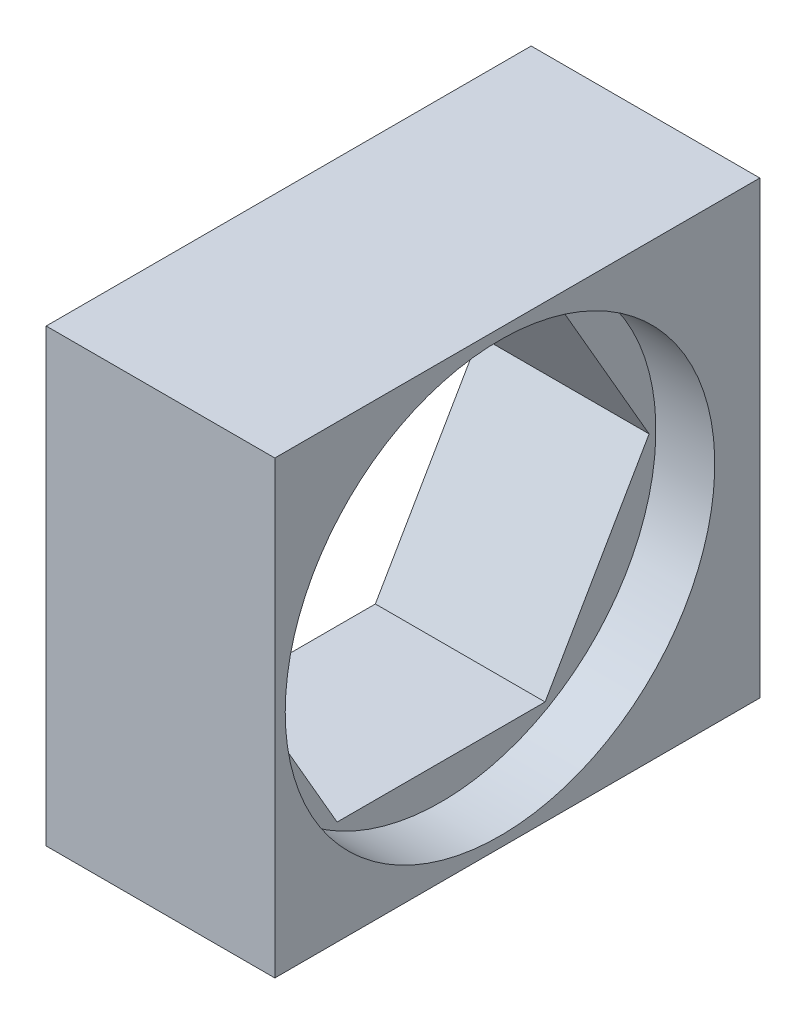
ISO-10303-21;
HEADER;
FILE_DESCRIPTION(('STEP AP214'),'2;1');
FILE_NAME('part.step','',(''),(''),'','','');
FILE_SCHEMA(('AUTOMOTIVE_DESIGN { 1 0 10303 214 1 1 1 1 }'));
ENDSEC;
DATA;
#1=APPLICATION_CONTEXT('core data for automotive mechanical design processes');
#2=APPLICATION_PROTOCOL_DEFINITION('international standard','automotive_design',2000,#1);
#3=PRODUCT_CONTEXT('',#1,'mechanical');
#4=PRODUCT('Part','Part','',(#3));
#5=PRODUCT_RELATED_PRODUCT_CATEGORY('part','',(#4));
#6=PRODUCT_DEFINITION_FORMATION('','',#4);
#7=PRODUCT_DEFINITION_CONTEXT('part definition',#1,'design');
#8=PRODUCT_DEFINITION('design','',#6,#7);
#9=PRODUCT_DEFINITION_SHAPE('','',#8);
#10=(LENGTH_UNIT() NAMED_UNIT(*) SI_UNIT(.MILLI.,.METRE.));
#11=(NAMED_UNIT(*) PLANE_ANGLE_UNIT() SI_UNIT($,.RADIAN.));
#12=(NAMED_UNIT(*) SI_UNIT($,.STERADIAN.) SOLID_ANGLE_UNIT());
#13=UNCERTAINTY_MEASURE_WITH_UNIT(LENGTH_MEASURE(1.E-05),#10,'distance_accuracy_value','');
#14=(GEOMETRIC_REPRESENTATION_CONTEXT(3) GLOBAL_UNCERTAINTY_ASSIGNED_CONTEXT((#13)) GLOBAL_UNIT_ASSIGNED_CONTEXT((#10,
#11,#12)) REPRESENTATION_CONTEXT('',''));
#15=CARTESIAN_POINT('',(0.,0.,0.));
#16=DIRECTION('',(0.,0.,1.));
#17=DIRECTION('',(1.,0.,0.));
#18=AXIS2_PLACEMENT_3D('',#15,#16,#17);
#19=CARTESIAN_POINT('',(46.308348754,-23.8,-22.5022213997861));
#20=DIRECTION('',(0.,-1.,0.));
#21=DIRECTION('',(0.,0.,-1.));
#22=AXIS2_PLACEMENT_3D('',#19,#20,#21);
#23=PLANE('',#22);
#24=DIRECTION('',(-1.,0.,0.));
#25=VECTOR('',#24,1.);
#26=CARTESIAN_POINT('',(46.308348754,-23.8,-22.5022213997861));
#27=LINE('',#26,#25);
#28=CARTESIAN_POINT('',(46.008348754,-23.8,-22.5022213997861));
#29=VERTEX_POINT('',#28);
#30=CARTESIAN_POINT('',(41.108348754,-23.8,-22.5022213997861));
#31=VERTEX_POINT('',#30);
#32=EDGE_CURVE('E61',#29,#31,#27,.T.);
#33=ORIENTED_EDGE('',*,*,#32,.F.);
#34=DIRECTION('',(0.,0.,1.));
#35=VECTOR('',#34,1.);
#36=CARTESIAN_POINT('',(46.008348754,-23.8,-22.5022213997861));
#37=LINE('',#36,#35);
#38=CARTESIAN_POINT('',(46.008348754,-23.8,-16.4977786002139));
#39=VERTEX_POINT('',#38);
#40=EDGE_CURVE('E60',#29,#39,#37,.T.);
#41=ORIENTED_EDGE('',*,*,#40,.T.);
#42=DIRECTION('',(-1.,0.,0.));
#43=VECTOR('',#42,1.);
#44=CARTESIAN_POINT('',(46.308348754,-23.8,-16.4977786002139));
#45=LINE('',#44,#43);
#46=CARTESIAN_POINT('',(41.108348754,-23.8,-16.4977786002139));
#47=VERTEX_POINT('',#46);
#48=EDGE_CURVE('E145',#39,#47,#45,.T.);
#49=ORIENTED_EDGE('',*,*,#48,.T.);
#50=DIRECTION('',(0.,0.,-1.));
#51=VECTOR('',#50,1.);
#52=CARTESIAN_POINT('',(41.108348754,-23.8,-13.));
#53=LINE('',#52,#51);
#54=EDGE_CURVE('E49',#47,#31,#53,.T.);
#55=ORIENTED_EDGE('',*,*,#54,.T.);
#56=EDGE_LOOP('',(#33,#41,#49,#55));
#57=FACE_BOUND('',#56,.T.);
#58=ADVANCED_FACE('F41',(#57),#23,.T.);
#59=CARTESIAN_POINT('',(46.308348754,-23.8,-16.4977786002139));
#60=DIRECTION('',(0.,-0.5,-0.866025403784438));
#61=DIRECTION('',(0.,0.866025403784438,-0.5));
#62=AXIS2_PLACEMENT_3D('',#59,#60,#61);
#63=PLANE('',#62);
#64=ORIENTED_EDGE('',*,*,#48,.F.);
#65=DIRECTION('',(0.,-0.866025403784438,0.5));
#66=VECTOR('',#65,1.);
#67=CARTESIAN_POINT('',(46.008348754,-23.8,-16.4977786002139));
#68=LINE('',#67,#66);
#69=CARTESIAN_POINT('',(46.008348754,-29.,-13.4955572004279));
#70=VERTEX_POINT('',#69);
#71=EDGE_CURVE('E203',#39,#70,#68,.T.);
#72=ORIENTED_EDGE('',*,*,#71,.T.);
#73=DIRECTION('',(-1.,0.,0.));
#74=VECTOR('',#73,1.);
#75=CARTESIAN_POINT('',(46.308348754,-29.,-13.4955572004279));
#76=LINE('',#75,#74);
#77=CARTESIAN_POINT('',(41.108348754,-29.,-13.4955572004279));
#78=VERTEX_POINT('',#77);
#79=EDGE_CURVE('E142',#70,#78,#76,.T.);
#80=ORIENTED_EDGE('',*,*,#79,.T.);
#81=DIRECTION('',(0.,0.866025403784439,-0.5));
#82=VECTOR('',#81,1.);
#83=CARTESIAN_POINT('',(41.108348754,-24.3395825622994,-16.1862504626203));
#84=LINE('',#83,#82);
#85=EDGE_CURVE('E183',#78,#47,#84,.T.);
#86=ORIENTED_EDGE('',*,*,#85,.T.);
#87=EDGE_LOOP('',(#64,#72,#80,#86));
#88=FACE_BOUND('',#87,.T.);
#89=ADVANCED_FACE('F238',(#88),#63,.T.);
#90=CARTESIAN_POINT('',(46.308348754,-29.,-13.4955572004279));
#91=DIRECTION('',(0.,0.5,-0.866025403784439));
#92=DIRECTION('',(0.,0.866025403784439,0.5));
#93=AXIS2_PLACEMENT_3D('',#90,#91,#92);
#94=PLANE('',#93);
#95=ORIENTED_EDGE('',*,*,#79,.F.);
#96=DIRECTION('',(0.,-0.866025403784439,-0.5));
#97=VECTOR('',#96,1.);
#98=CARTESIAN_POINT('',(46.008348754,-29.,-13.4955572004279));
#99=LINE('',#98,#97);
#100=CARTESIAN_POINT('',(46.008348754,-34.2,-16.4977786002139));
#101=VERTEX_POINT('',#100);
#102=EDGE_CURVE('E200',#70,#101,#99,.T.);
#103=ORIENTED_EDGE('',*,*,#102,.T.);
#104=DIRECTION('',(-1.,0.,0.));
#105=VECTOR('',#104,1.);
#106=CARTESIAN_POINT('',(46.308348754,-34.2,-16.4977786002139));
#107=LINE('',#106,#105);
#108=CARTESIAN_POINT('',(41.108348754,-34.2,-16.4977786002139));
#109=VERTEX_POINT('',#108);
#110=EDGE_CURVE('E136',#101,#109,#107,.T.);
#111=ORIENTED_EDGE('',*,*,#110,.T.);
#112=DIRECTION('',(0.,0.866025403784439,0.5));
#113=VECTOR('',#112,1.);
#114=CARTESIAN_POINT('',(41.108348754,-23.9104174377006,-10.5570853380215));
#115=LINE('',#114,#113);
#116=EDGE_CURVE('E185',#109,#78,#115,.T.);
#117=ORIENTED_EDGE('',*,*,#116,.T.);
#118=EDGE_LOOP('',(#95,#103,#111,#117));
#119=FACE_BOUND('',#118,.T.);
#120=ADVANCED_FACE('F244',(#119),#94,.T.);
#121=CARTESIAN_POINT('',(46.308348754,-34.2,-16.4977786002139));
#122=DIRECTION('',(0.,1.,0.));
#123=DIRECTION('',(0.,0.,1.));
#124=AXIS2_PLACEMENT_3D('',#121,#122,#123);
#125=PLANE('',#124);
#126=ORIENTED_EDGE('',*,*,#110,.F.);
#127=DIRECTION('',(0.,0.,-1.));
#128=VECTOR('',#127,1.);
#129=CARTESIAN_POINT('',(46.008348754,-34.2,-16.4977786002139));
#130=LINE('',#129,#128);
#131=CARTESIAN_POINT('',(46.008348754,-34.2,-22.5022213997861));
#132=VERTEX_POINT('',#131);
#133=EDGE_CURVE('E126',#101,#132,#130,.T.);
#134=ORIENTED_EDGE('',*,*,#133,.T.);
#135=DIRECTION('',(-1.,0.,0.));
#136=VECTOR('',#135,1.);
#137=CARTESIAN_POINT('',(46.308348754,-34.2,-22.5022213997861));
#138=LINE('',#137,#136);
#139=CARTESIAN_POINT('',(41.108348754,-34.2,-22.5022213997861));
#140=VERTEX_POINT('',#139);
#141=EDGE_CURVE('E130',#132,#140,#138,.T.);
#142=ORIENTED_EDGE('',*,*,#141,.T.);
#143=DIRECTION('',(0.,0.,1.));
#144=VECTOR('',#143,1.);
#145=CARTESIAN_POINT('',(41.108348754,-34.2,-13.));
#146=LINE('',#145,#144);
#147=EDGE_CURVE('E178',#140,#109,#146,.T.);
#148=ORIENTED_EDGE('',*,*,#147,.T.);
#149=EDGE_LOOP('',(#126,#134,#142,#148));
#150=FACE_BOUND('',#149,.T.);
#151=ADVANCED_FACE('F197',(#150),#125,.T.);
#152=CARTESIAN_POINT('',(46.308348754,-34.2,-22.5022213997861));
#153=DIRECTION('',(0.,0.5,0.866025403784438));
#154=DIRECTION('',(0.,-0.866025403784438,0.500000000000001));
#155=AXIS2_PLACEMENT_3D('',#152,#153,#154);
#156=PLANE('',#155);
#157=ORIENTED_EDGE('',*,*,#141,.F.);
#158=DIRECTION('',(0.,0.866025403784438,-0.500000000000001));
#159=VECTOR('',#158,1.);
#160=CARTESIAN_POINT('',(46.008348754,-34.2,-22.5022213997861));
#161=LINE('',#160,#159);
#162=CARTESIAN_POINT('',(46.008348754,-29.,-25.5044427995721));
#163=VERTEX_POINT('',#162);
#164=EDGE_CURVE('E117',#132,#163,#161,.T.);
#165=ORIENTED_EDGE('',*,*,#164,.T.);
#166=DIRECTION('',(-1.,0.,0.));
#167=VECTOR('',#166,1.);
#168=CARTESIAN_POINT('',(46.308348754,-29.,-25.5044427995721));
#169=LINE('',#168,#167);
#170=CARTESIAN_POINT('',(41.108348754,-29.,-25.5044427995721));
#171=VERTEX_POINT('',#170);
#172=EDGE_CURVE('E127',#163,#171,#169,.T.);
#173=ORIENTED_EDGE('',*,*,#172,.T.);
#174=DIRECTION('',(0.,-0.866025403784438,0.500000000000001));
#175=VECTOR('',#174,1.);
#176=CARTESIAN_POINT('',(41.108348754,-29.5395825622994,-25.1929146619785));
#177=LINE('',#176,#175);
#178=EDGE_CURVE('E180',#171,#140,#177,.T.);
#179=ORIENTED_EDGE('',*,*,#178,.T.);
#180=EDGE_LOOP('',(#157,#165,#173,#179));
#181=FACE_BOUND('',#180,.T.);
#182=ADVANCED_FACE('F123',(#181),#156,.T.);
#183=CARTESIAN_POINT('',(46.308348754,-29.,-25.5044427995721));
#184=DIRECTION('',(0.,-0.5,0.866025403784438));
#185=DIRECTION('',(0.,-0.866025403784439,-0.5));
#186=AXIS2_PLACEMENT_3D('',#183,#184,#185);
#187=PLANE('',#186);
#188=ORIENTED_EDGE('',*,*,#172,.F.);
#189=DIRECTION('',(0.,0.866025403784439,0.5));
#190=VECTOR('',#189,1.);
#191=CARTESIAN_POINT('',(46.008348754,-29.,-25.5044427995721));
#192=LINE('',#191,#190);
#193=EDGE_CURVE('E11',#163,#29,#192,.T.);
#194=ORIENTED_EDGE('',*,*,#193,.T.);
#195=ORIENTED_EDGE('',*,*,#32,.T.);
#196=DIRECTION('',(0.,-0.866025403784439,-0.5));
#197=VECTOR('',#196,1.);
#198=CARTESIAN_POINT('',(41.108348754,-18.7104174377006,-19.5637495373797));
#199=LINE('',#198,#197);
#200=EDGE_CURVE('E131',#31,#171,#199,.T.);
#201=ORIENTED_EDGE('',*,*,#200,.T.);
#202=EDGE_LOOP('',(#188,#194,#195,#201));
#203=FACE_BOUND('',#202,.T.);
#204=ADVANCED_FACE('F133',(#203),#187,.T.);
#205=CARTESIAN_POINT('',(41.108348754,-22.5,-13.));
#206=DIRECTION('',(1.,0.,0.));
#207=DIRECTION('',(0.,0.,-1.));
#208=AXIS2_PLACEMENT_3D('',#205,#206,#207);
#209=PLANE('',#208);
#210=DIRECTION('',(0.,-1.,0.));
#211=VECTOR('',#210,1.);
#212=CARTESIAN_POINT('',(41.108348754,-22.5,-27.));
#213=LINE('',#212,#211);
#214=CARTESIAN_POINT('',(41.108348754,-22.5,-27.));
#215=VERTEX_POINT('',#214);
#216=CARTESIAN_POINT('',(41.108348754,-35.5,-27.));
#217=VERTEX_POINT('',#216);
#218=EDGE_CURVE('E148',#215,#217,#213,.T.);
#219=ORIENTED_EDGE('',*,*,#218,.T.);
#220=DIRECTION('',(0.,0.,-1.));
#221=VECTOR('',#220,1.);
#222=CARTESIAN_POINT('',(41.108348754,-35.5,-13.));
#223=LINE('',#222,#221);
#224=CARTESIAN_POINT('',(41.108348754,-35.5,-13.));
#225=VERTEX_POINT('',#224);
#226=EDGE_CURVE('E171',#225,#217,#223,.T.);
#227=ORIENTED_EDGE('',*,*,#226,.F.);
#228=DIRECTION('',(0.,-1.,0.));
#229=VECTOR('',#228,1.);
#230=CARTESIAN_POINT('',(41.108348754,-22.5,-13.));
#231=LINE('',#230,#229);
#232=CARTESIAN_POINT('',(41.108348754,-22.5,-13.));
#233=VERTEX_POINT('',#232);
#234=EDGE_CURVE('E150',#233,#225,#231,.T.);
#235=ORIENTED_EDGE('',*,*,#234,.F.);
#236=DIRECTION('',(0.,0.,-1.));
#237=VECTOR('',#236,1.);
#238=CARTESIAN_POINT('',(41.108348754,-22.5,-13.));
#239=LINE('',#238,#237);
#240=EDGE_CURVE('E160',#233,#215,#239,.T.);
#241=ORIENTED_EDGE('',*,*,#240,.T.);
#242=EDGE_LOOP('',(#219,#227,#235,#241));
#243=FACE_BOUND('',#242,.T.);
#244=ORIENTED_EDGE('',*,*,#54,.F.);
#245=ORIENTED_EDGE('',*,*,#85,.F.);
#246=ORIENTED_EDGE('',*,*,#116,.F.);
#247=ORIENTED_EDGE('',*,*,#147,.F.);
#248=ORIENTED_EDGE('',*,*,#178,.F.);
#249=ORIENTED_EDGE('',*,*,#200,.F.);
#250=EDGE_LOOP('',(#244,#245,#246,#247,#248,#249));
#251=FACE_BOUND('',#250,.T.);
#252=ADVANCED_FACE('F43',(#243,#251),#209,.F.);
#253=CARTESIAN_POINT('',(41.108348754,-35.5,-13.));
#254=DIRECTION('',(0.,1.,0.));
#255=DIRECTION('',(0.,0.,1.));
#256=AXIS2_PLACEMENT_3D('',#253,#254,#255);
#257=PLANE('',#256);
#258=DIRECTION('',(1.,0.,0.));
#259=VECTOR('',#258,1.);
#260=CARTESIAN_POINT('',(41.108348754,-35.5,-27.));
#261=LINE('',#260,#259);
#262=CARTESIAN_POINT('',(47.708348754,-35.5,-27.));
#263=VERTEX_POINT('',#262);
#264=EDGE_CURVE('E159',#217,#263,#261,.T.);
#265=ORIENTED_EDGE('',*,*,#264,.T.);
#266=DIRECTION('',(0.,0.,-1.));
#267=VECTOR('',#266,1.);
#268=CARTESIAN_POINT('',(47.708348754,-35.5,-13.));
#269=LINE('',#268,#267);
#270=CARTESIAN_POINT('',(47.708348754,-35.5,-13.));
#271=VERTEX_POINT('',#270);
#272=EDGE_CURVE('E168',#271,#263,#269,.T.);
#273=ORIENTED_EDGE('',*,*,#272,.F.);
#274=DIRECTION('',(1.,0.,0.));
#275=VECTOR('',#274,1.);
#276=CARTESIAN_POINT('',(41.108348754,-35.5,-13.));
#277=LINE('',#276,#275);
#278=EDGE_CURVE('E147',#225,#271,#277,.T.);
#279=ORIENTED_EDGE('',*,*,#278,.F.);
#280=ORIENTED_EDGE('',*,*,#226,.T.);
#281=EDGE_LOOP('',(#265,#273,#279,#280));
#282=FACE_BOUND('',#281,.T.);
#283=ADVANCED_FACE('F214',(#282),#257,.F.);
#284=CARTESIAN_POINT('',(47.708348754,-35.5,-13.));
#285=DIRECTION('',(-1.,0.,0.));
#286=DIRECTION('',(0.,0.,1.));
#287=AXIS2_PLACEMENT_3D('',#284,#285,#286);
#288=PLANE('',#287);
#289=CARTESIAN_POINT('',(47.708348754,-29.,-19.5));
#290=DIRECTION('',(-1.,0.,0.));
#291=DIRECTION('',(0.,0.,1.));
#292=AXIS2_PLACEMENT_3D('',#289,#290,#291);
#293=CIRCLE('',#292,6.2);
#294=CARTESIAN_POINT('',(47.708348754,-29.,-13.3));
#295=VERTEX_POINT('',#294);
#296=EDGE_CURVE('E44',#295,#295,#293,.F.);
#297=ORIENTED_EDGE('',*,*,#296,.F.);
#298=EDGE_LOOP('',(#297));
#299=FACE_BOUND('',#298,.T.);
#300=DIRECTION('',(0.,1.,0.));
#301=VECTOR('',#300,1.);
#302=CARTESIAN_POINT('',(47.708348754,-35.5,-27.));
#303=LINE('',#302,#301);
#304=CARTESIAN_POINT('',(47.708348754,-22.5,-27.));
#305=VERTEX_POINT('',#304);
#306=EDGE_CURVE('E165',#263,#305,#303,.T.);
#307=ORIENTED_EDGE('',*,*,#306,.T.);
#308=DIRECTION('',(0.,0.,-1.));
#309=VECTOR('',#308,1.);
#310=CARTESIAN_POINT('',(47.708348754,-22.5,-13.));
#311=LINE('',#310,#309);
#312=CARTESIAN_POINT('',(47.708348754,-22.5,-13.));
#313=VERTEX_POINT('',#312);
#314=EDGE_CURVE('E170',#313,#305,#311,.T.);
#315=ORIENTED_EDGE('',*,*,#314,.F.);
#316=DIRECTION('',(0.,1.,0.));
#317=VECTOR('',#316,1.);
#318=CARTESIAN_POINT('',(47.708348754,-35.5,-13.));
#319=LINE('',#318,#317);
#320=EDGE_CURVE('E153',#271,#313,#319,.T.);
#321=ORIENTED_EDGE('',*,*,#320,.F.);
#322=ORIENTED_EDGE('',*,*,#272,.T.);
#323=EDGE_LOOP('',(#307,#315,#321,#322));
#324=FACE_BOUND('',#323,.T.);
#325=ADVANCED_FACE('F211',(#299,#324),#288,.F.);
#326=CARTESIAN_POINT('',(47.708348754,-22.5,-13.));
#327=DIRECTION('',(0.,-1.,0.));
#328=DIRECTION('',(0.,0.,-1.));
#329=AXIS2_PLACEMENT_3D('',#326,#327,#328);
#330=PLANE('',#329);
#331=DIRECTION('',(-1.,0.,0.));
#332=VECTOR('',#331,1.);
#333=CARTESIAN_POINT('',(47.708348754,-22.5,-27.));
#334=LINE('',#333,#332);
#335=EDGE_CURVE('E151',#305,#215,#334,.T.);
#336=ORIENTED_EDGE('',*,*,#335,.T.);
#337=ORIENTED_EDGE('',*,*,#240,.F.);
#338=DIRECTION('',(-1.,0.,0.));
#339=VECTOR('',#338,1.);
#340=CARTESIAN_POINT('',(47.708348754,-22.5,-13.));
#341=LINE('',#340,#339);
#342=EDGE_CURVE('E154',#313,#233,#341,.T.);
#343=ORIENTED_EDGE('',*,*,#342,.F.);
#344=ORIENTED_EDGE('',*,*,#314,.T.);
#345=EDGE_LOOP('',(#336,#337,#343,#344));
#346=FACE_BOUND('',#345,.T.);
#347=ADVANCED_FACE('F212',(#346),#330,.F.);
#348=CARTESIAN_POINT('',(0.,0.,-13.));
#349=DIRECTION('',(0.,0.,1.));
#350=DIRECTION('',(1.,0.,0.));
#351=AXIS2_PLACEMENT_3D('',#348,#349,#350);
#352=PLANE('',#351);
#353=ORIENTED_EDGE('',*,*,#234,.T.);
#354=ORIENTED_EDGE('',*,*,#278,.T.);
#355=ORIENTED_EDGE('',*,*,#320,.T.);
#356=ORIENTED_EDGE('',*,*,#342,.T.);
#357=EDGE_LOOP('',(#353,#354,#355,#356));
#358=FACE_BOUND('',#357,.T.);
#359=ADVANCED_FACE('F235',(#358),#352,.T.);
#360=CARTESIAN_POINT('',(0.,0.,-27.));
#361=DIRECTION('',(0.,0.,1.));
#362=DIRECTION('',(1.,0.,0.));
#363=AXIS2_PLACEMENT_3D('',#360,#361,#362);
#364=PLANE('',#363);
#365=ORIENTED_EDGE('',*,*,#218,.F.);
#366=ORIENTED_EDGE('',*,*,#335,.F.);
#367=ORIENTED_EDGE('',*,*,#306,.F.);
#368=ORIENTED_EDGE('',*,*,#264,.F.);
#369=EDGE_LOOP('',(#365,#366,#367,#368));
#370=FACE_BOUND('',#369,.T.);
#371=ADVANCED_FACE('F230',(#370),#364,.F.);
#372=CARTESIAN_POINT('',(47.908348754,-29.,-19.5));
#373=DIRECTION('',(-1.,0.,0.));
#374=DIRECTION('',(0.,0.,1.));
#375=AXIS2_PLACEMENT_3D('',#372,#373,#374);
#376=CYLINDRICAL_SURFACE('',#375,6.2);
#377=CARTESIAN_POINT('',(46.008348754,-29.,-19.5));
#378=DIRECTION('',(1.,0.,0.));
#379=DIRECTION('',(0.,0.,-1.));
#380=AXIS2_PLACEMENT_3D('',#377,#378,#379);
#381=CIRCLE('',#380,6.2);
#382=CARTESIAN_POINT('',(46.008348754,-29.,-13.3));
#383=VERTEX_POINT('',#382);
#384=EDGE_CURVE('E129',#383,#383,#381,.T.);
#385=CARTESIAN_POINT('',(46.008348754,-29.,-13.3));
#386=CARTESIAN_POINT('',(46.0260570873333,-29.,-13.3));
#387=CARTESIAN_POINT('',(46.0437654206667,-29.,-13.3));
#388=CARTESIAN_POINT('',(46.0791820873333,-29.,-13.3));
#389=CARTESIAN_POINT('',(46.0968904206667,-29.,-13.3));
#390=CARTESIAN_POINT('',(46.1323070873333,-29.,-13.3));
#391=CARTESIAN_POINT('',(46.1500154206667,-29.,-13.3));
#392=CARTESIAN_POINT('',(46.1854320873333,-29.,-13.3));
#393=CARTESIAN_POINT('',(46.2031404206667,-29.,-13.3));
#394=CARTESIAN_POINT('',(46.2385570873333,-29.,-13.3));
#395=CARTESIAN_POINT('',(46.2562654206667,-29.,-13.3));
#396=CARTESIAN_POINT('',(46.2916820873333,-29.,-13.3));
#397=CARTESIAN_POINT('',(46.3093904206667,-29.,-13.3));
#398=CARTESIAN_POINT('',(46.3448070873333,-29.,-13.3));
#399=CARTESIAN_POINT('',(46.3625154206667,-29.,-13.3));
#400=CARTESIAN_POINT('',(46.3979320873333,-29.,-13.3));
#401=CARTESIAN_POINT('',(46.4156404206667,-29.,-13.3));
#402=CARTESIAN_POINT('',(46.4510570873333,-29.,-13.3));
#403=CARTESIAN_POINT('',(46.4687654206667,-29.,-13.3));
#404=CARTESIAN_POINT('',(46.5041820873333,-29.,-13.3));
#405=CARTESIAN_POINT('',(46.5218904206667,-29.,-13.3));
#406=CARTESIAN_POINT('',(46.5573070873333,-29.,-13.3));
#407=CARTESIAN_POINT('',(46.5750154206667,-29.,-13.3));
#408=CARTESIAN_POINT('',(46.6104320873333,-29.,-13.3));
#409=CARTESIAN_POINT('',(46.6281404206667,-29.,-13.3));
#410=CARTESIAN_POINT('',(46.6635570873333,-29.,-13.3));
#411=CARTESIAN_POINT('',(46.6812654206667,-29.,-13.3));
#412=CARTESIAN_POINT('',(46.7166820873333,-29.,-13.3));
#413=CARTESIAN_POINT('',(46.7343904206667,-29.,-13.3));
#414=CARTESIAN_POINT('',(46.7698070873333,-29.,-13.3));
#415=CARTESIAN_POINT('',(46.7875154206667,-29.,-13.3));
#416=CARTESIAN_POINT('',(46.8229320873333,-29.,-13.3));
#417=CARTESIAN_POINT('',(46.8406404206667,-29.,-13.3));
#418=CARTESIAN_POINT('',(46.8760570873333,-29.,-13.3));
#419=CARTESIAN_POINT('',(46.8937654206667,-29.,-13.3));
#420=CARTESIAN_POINT('',(46.9291820873333,-29.,-13.3));
#421=CARTESIAN_POINT('',(46.9468904206667,-29.,-13.3));
#422=CARTESIAN_POINT('',(46.9823070873333,-29.,-13.3));
#423=CARTESIAN_POINT('',(47.0000154206667,-29.,-13.3));
#424=CARTESIAN_POINT('',(47.0354320873333,-29.,-13.3));
#425=CARTESIAN_POINT('',(47.0531404206667,-29.,-13.3));
#426=CARTESIAN_POINT('',(47.0885570873333,-29.,-13.3));
#427=CARTESIAN_POINT('',(47.1062654206667,-29.,-13.3));
#428=CARTESIAN_POINT('',(47.1416820873333,-29.,-13.3));
#429=CARTESIAN_POINT('',(47.1593904206667,-29.,-13.3));
#430=CARTESIAN_POINT('',(47.1948070873333,-29.,-13.3));
#431=CARTESIAN_POINT('',(47.2125154206667,-29.,-13.3));
#432=CARTESIAN_POINT('',(47.2479320873333,-29.,-13.3));
#433=CARTESIAN_POINT('',(47.2656404206667,-29.,-13.3));
#434=CARTESIAN_POINT('',(47.3010570873333,-29.,-13.3));
#435=CARTESIAN_POINT('',(47.3187654206667,-29.,-13.3));
#436=CARTESIAN_POINT('',(47.3541820873333,-29.,-13.3));
#437=CARTESIAN_POINT('',(47.3718904206667,-29.,-13.3));
#438=CARTESIAN_POINT('',(47.4073070873333,-29.,-13.3));
#439=CARTESIAN_POINT('',(47.4250154206667,-29.,-13.3));
#440=CARTESIAN_POINT('',(47.4604320873333,-29.,-13.3));
#441=CARTESIAN_POINT('',(47.4781404206667,-29.,-13.3));
#442=CARTESIAN_POINT('',(47.5135570873333,-29.,-13.3));
#443=CARTESIAN_POINT('',(47.5312654206667,-29.,-13.3));
#444=CARTESIAN_POINT('',(47.5666820873333,-29.,-13.3));
#445=CARTESIAN_POINT('',(47.5843904206667,-29.,-13.3));
#446=CARTESIAN_POINT('',(47.6198070873333,-29.,-13.3));
#447=CARTESIAN_POINT('',(47.6375154206667,-29.,-13.3));
#448=CARTESIAN_POINT('',(47.6729320873333,-29.,-13.3));
#449=CARTESIAN_POINT('',(47.6906404206667,-29.,-13.3));
#450=CARTESIAN_POINT('',(47.708348754,-29.,-13.3));
#451=B_SPLINE_CURVE_WITH_KNOTS('',3,(#385,#386,#387,#388,#389,#390,#391,#392,#393,#394,#395,
#396,#397,#398,#399,#400,#401,#402,#403,#404,#405,#406,#407,#408,#409,#410,#411,#412,#413,#414,
#415,#416,#417,#418,#419,#420,#421,#422,#423,#424,#425,#426,#427,#428,#429,#430,#431,#432,#433,
#434,#435,#436,#437,#438,#439,#440,#441,#442,#443,#444,#445,#446,#447,#448,#449,#450),
.UNSPECIFIED.,.F.,.F.,(4,2,2,2,2,2,2,2,2,2,2,2,2,2,2,2,2,2,2,2,2,2,2,2,2,2,2,2,2,2,2,2,4),(0.,
0.0531249999999941,0.106249999999995,0.159374999999996,0.212499999999997,0.265624999999999,
0.31875,0.371875000000001,0.425000000000002,0.478124999999996,0.531249999999997,
0.584374999999998,0.637499999999999,0.690625,0.743750000000001,0.796875000000002,
0.850000000000004,0.903124999999998,0.956249999999999,1.009375,1.0625,1.115625,1.16875,1.221875,
1.27500000000001,1.328125,1.38125,1.434375,1.4875,1.540625,1.59375,1.64687500000001,
1.70000000000001),.UNSPECIFIED.);
#452=EDGE_CURVE('BSEAM207',#383,#295,#451,.T.);
#453=ORIENTED_EDGE('',*,*,#384,.F.);
#454=ORIENTED_EDGE('',*,*,#296,.T.);
#455=ORIENTED_EDGE('',*,*,#452,.T.);
#456=ORIENTED_EDGE('',*,*,#452,.F.);
#457=EDGE_LOOP('',(#453,#455,#454,#456));
#458=FACE_BOUND('',#457,.T.);
#459=ADVANCED_FACE('F207',(#458),#376,.F.);
#460=CARTESIAN_POINT('',(46.008348754,-29.,-19.5));
#461=DIRECTION('',(1.,0.,0.));
#462=DIRECTION('',(0.,0.,-1.));
#463=AXIS2_PLACEMENT_3D('',#460,#461,#462);
#464=PLANE('',#463);
#465=ORIENTED_EDGE('',*,*,#193,.F.);
#466=ORIENTED_EDGE('',*,*,#164,.F.);
#467=ORIENTED_EDGE('',*,*,#133,.F.);
#468=ORIENTED_EDGE('',*,*,#102,.F.);
#469=ORIENTED_EDGE('',*,*,#71,.F.);
#470=ORIENTED_EDGE('',*,*,#40,.F.);
#471=EDGE_LOOP('',(#465,#466,#467,#468,#469,#470));
#472=FACE_BOUND('',#471,.T.);
#473=ORIENTED_EDGE('',*,*,#384,.T.);
#474=EDGE_LOOP('',(#473));
#475=FACE_BOUND('',#474,.T.);
#476=ADVANCED_FACE('F120',(#472,#475),#464,.T.);
#477=CLOSED_SHELL('',(#58,#89,#120,#151,#182,#204,#252,#283,#325,#347,#359,#371,#459,#476));
#478=MANIFOLD_SOLID_BREP('B2',#477);
#479=ADVANCED_BREP_SHAPE_REPRESENTATION('',(#18,#478),#14);
#480=SHAPE_DEFINITION_REPRESENTATION(#9,#479);
ENDSEC;
END-ISO-10303-21;
